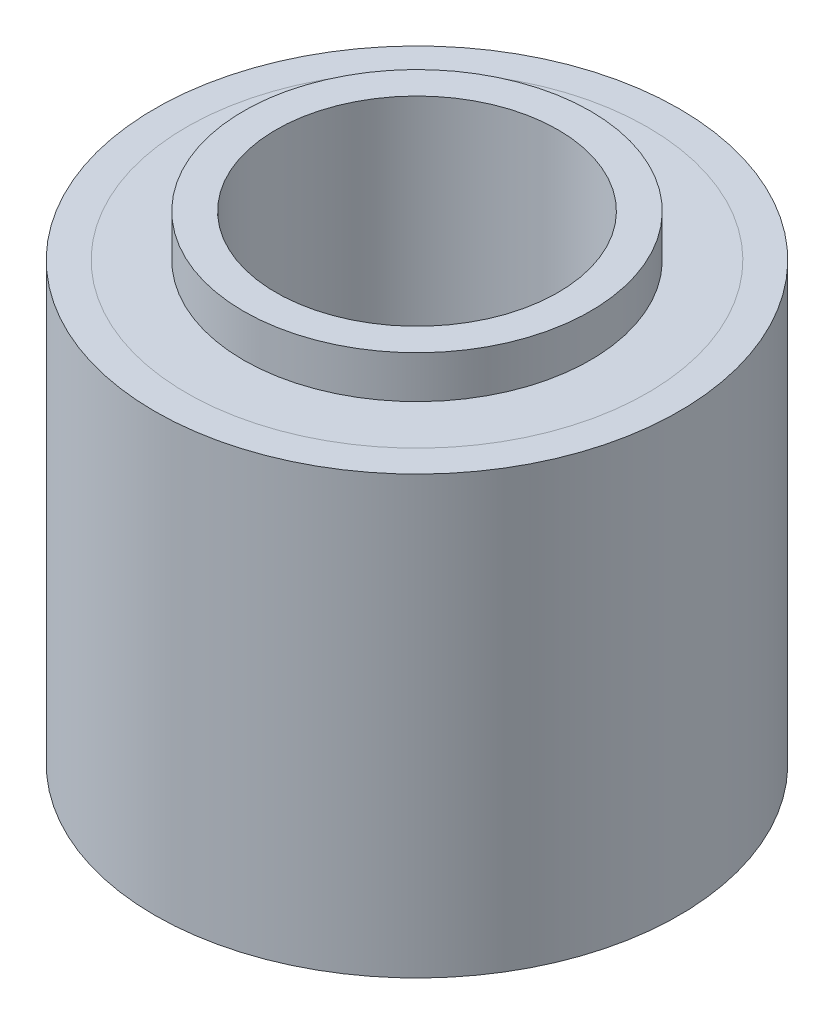
ISO-10303-21;
HEADER;
FILE_DESCRIPTION(('STEP AP214'),'2;1');
FILE_NAME('part.step','',(''),(''),'','','');
FILE_SCHEMA(('AUTOMOTIVE_DESIGN { 1 0 10303 214 1 1 1 1 }'));
ENDSEC;
DATA;
#1=APPLICATION_CONTEXT('core data for automotive mechanical design processes');
#2=APPLICATION_PROTOCOL_DEFINITION('international standard','automotive_design',2000,#1);
#3=PRODUCT_CONTEXT('',#1,'mechanical');
#4=PRODUCT('Part','Part','',(#3));
#5=PRODUCT_RELATED_PRODUCT_CATEGORY('part','',(#4));
#6=PRODUCT_DEFINITION_FORMATION('','',#4);
#7=PRODUCT_DEFINITION_CONTEXT('part definition',#1,'design');
#8=PRODUCT_DEFINITION('design','',#6,#7);
#9=PRODUCT_DEFINITION_SHAPE('','',#8);
#10=(LENGTH_UNIT() NAMED_UNIT(*) SI_UNIT(.MILLI.,.METRE.));
#11=(NAMED_UNIT(*) PLANE_ANGLE_UNIT() SI_UNIT($,.RADIAN.));
#12=(NAMED_UNIT(*) SI_UNIT($,.STERADIAN.) SOLID_ANGLE_UNIT());
#13=UNCERTAINTY_MEASURE_WITH_UNIT(LENGTH_MEASURE(1.E-05),#10,'distance_accuracy_value','');
#14=(GEOMETRIC_REPRESENTATION_CONTEXT(3) GLOBAL_UNCERTAINTY_ASSIGNED_CONTEXT((#13)) GLOBAL_UNIT_ASSIGNED_CONTEXT((#10,
#11,#12)) REPRESENTATION_CONTEXT('',''));
#15=CARTESIAN_POINT('',(0.,0.,0.));
#16=DIRECTION('',(0.,0.,1.));
#17=DIRECTION('',(1.,0.,0.));
#18=AXIS2_PLACEMENT_3D('',#15,#16,#17);
#19=CARTESIAN_POINT('',(0.,0.,0.));
#20=DIRECTION('',(0.,-1.,0.));
#21=DIRECTION('',(0.,0.,-1.));
#22=AXIS2_PLACEMENT_3D('',#19,#20,#21);
#23=CYLINDRICAL_SURFACE('',#22,10.65);
#24=CARTESIAN_POINT('',(0.,0.,0.));
#25=DIRECTION('',(0.,-1.,0.));
#26=DIRECTION('',(0.,0.,-1.));
#27=AXIS2_PLACEMENT_3D('',#24,#25,#26);
#28=CIRCLE('',#27,10.65);
#29=CARTESIAN_POINT('',(0.,0.,-10.65));
#30=VERTEX_POINT('',#29);
#31=EDGE_CURVE('E53',#30,#30,#28,.T.);
#32=ORIENTED_EDGE('',*,*,#31,.T.);
#33=EDGE_LOOP('',(#32));
#34=FACE_BOUND('',#33,.T.);
#35=CARTESIAN_POINT('',(0.,26.8,0.));
#36=DIRECTION('',(0.,-1.,0.));
#37=DIRECTION('',(0.,0.,-1.));
#38=AXIS2_PLACEMENT_3D('',#35,#36,#37);
#39=CIRCLE('',#38,10.65);
#40=CARTESIAN_POINT('',(0.,26.8,-10.65));
#41=VERTEX_POINT('',#40);
#42=EDGE_CURVE('E11',#41,#41,#39,.T.);
#43=ORIENTED_EDGE('',*,*,#42,.F.);
#44=EDGE_LOOP('',(#43));
#45=FACE_BOUND('',#44,.T.);
#46=ADVANCED_FACE('F39',(#34,#45),#23,.F.);
#47=CARTESIAN_POINT('',(10.65,26.8,0.));
#48=DIRECTION('',(0.,1.,0.));
#49=DIRECTION('',(0.,0.,1.));
#50=AXIS2_PLACEMENT_3D('',#47,#48,#49);
#51=PLANE('',#50);
#52=ORIENTED_EDGE('',*,*,#42,.T.);
#53=EDGE_LOOP('',(#52));
#54=FACE_BOUND('',#53,.T.);
#55=CARTESIAN_POINT('',(0.,26.8,0.));
#56=DIRECTION('',(0.,-1.,0.));
#57=DIRECTION('',(0.,0.,-1.));
#58=AXIS2_PLACEMENT_3D('',#55,#56,#57);
#59=CIRCLE('',#58,14.15);
#60=CARTESIAN_POINT('',(0.,26.8,-14.15));
#61=VERTEX_POINT('',#60);
#62=EDGE_CURVE('E45',#61,#61,#59,.T.);
#63=ORIENTED_EDGE('',*,*,#62,.F.);
#64=EDGE_LOOP('',(#63));
#65=FACE_BOUND('',#64,.T.);
#66=ADVANCED_FACE('F69',(#54,#65),#51,.T.);
#67=CARTESIAN_POINT('',(0.,0.,0.));
#68=DIRECTION('',(0.,-1.,0.));
#69=DIRECTION('',(0.,0.,-1.));
#70=AXIS2_PLACEMENT_3D('',#67,#68,#69);
#71=CYLINDRICAL_SURFACE('',#70,14.15);
#72=ORIENTED_EDGE('',*,*,#62,.T.);
#73=EDGE_LOOP('',(#72));
#74=FACE_BOUND('',#73,.T.);
#75=CARTESIAN_POINT('',(0.,0.,0.));
#76=DIRECTION('',(0.,-1.,0.));
#77=DIRECTION('',(0.,0.,-1.));
#78=AXIS2_PLACEMENT_3D('',#75,#76,#77);
#79=CIRCLE('',#78,14.15);
#80=CARTESIAN_POINT('',(0.,0.,-14.15));
#81=VERTEX_POINT('',#80);
#82=EDGE_CURVE('E49',#81,#81,#79,.T.);
#83=ORIENTED_EDGE('',*,*,#82,.F.);
#84=EDGE_LOOP('',(#83));
#85=FACE_BOUND('',#84,.T.);
#86=ADVANCED_FACE('F63',(#74,#85),#71,.T.);
#87=CARTESIAN_POINT('',(10.65,0.,0.));
#88=DIRECTION('',(0.,-1.,0.));
#89=DIRECTION('',(0.,0.,-1.));
#90=AXIS2_PLACEMENT_3D('',#87,#88,#89);
#91=PLANE('',#90);
#92=ORIENTED_EDGE('',*,*,#82,.T.);
#93=EDGE_LOOP('',(#92));
#94=FACE_BOUND('',#93,.T.);
#95=ORIENTED_EDGE('',*,*,#31,.F.);
#96=EDGE_LOOP('',(#95));
#97=FACE_BOUND('',#96,.T.);
#98=ADVANCED_FACE('F61',(#94,#97),#91,.T.);
#99=CLOSED_SHELL('',(#46,#66,#86,#98));
#100=MANIFOLD_SOLID_BREP('B2',#99);
#101=CARTESIAN_POINT('',(0.,0.,0.));
#102=DIRECTION('',(0.,-1.,0.));
#103=DIRECTION('',(0.,0.,-1.));
#104=AXIS2_PLACEMENT_3D('',#101,#102,#103);
#105=CYLINDRICAL_SURFACE('',#104,14.15);
#106=CARTESIAN_POINT('',(0.,0.,0.));
#107=DIRECTION('',(0.,-1.,0.));
#108=DIRECTION('',(0.,0.,-1.));
#109=AXIS2_PLACEMENT_3D('',#106,#107,#108);
#110=CIRCLE('',#109,14.15);
#111=CARTESIAN_POINT('',(0.,0.,-14.15));
#112=VERTEX_POINT('',#111);
#113=EDGE_CURVE('E121',#112,#112,#110,.T.);
#114=ORIENTED_EDGE('',*,*,#113,.T.);
#115=EDGE_LOOP('',(#114));
#116=FACE_BOUND('',#115,.T.);
#117=CARTESIAN_POINT('',(0.,26.8,0.));
#118=DIRECTION('',(0.,-1.,0.));
#119=DIRECTION('',(0.,0.,-1.));
#120=AXIS2_PLACEMENT_3D('',#117,#118,#119);
#121=CIRCLE('',#120,14.15);
#122=CARTESIAN_POINT('',(0.,26.8,-14.15));
#123=VERTEX_POINT('',#122);
#124=EDGE_CURVE('E38',#123,#123,#121,.T.);
#125=ORIENTED_EDGE('',*,*,#124,.F.);
#126=EDGE_LOOP('',(#125));
#127=FACE_BOUND('',#126,.T.);
#128=ADVANCED_FACE('F107',(#116,#127),#105,.F.);
#129=CARTESIAN_POINT('',(14.15,26.8,0.));
#130=DIRECTION('',(0.,1.,0.));
#131=DIRECTION('',(0.,0.,1.));
#132=AXIS2_PLACEMENT_3D('',#129,#130,#131);
#133=PLANE('',#132);
#134=ORIENTED_EDGE('',*,*,#124,.T.);
#135=EDGE_LOOP('',(#134));
#136=FACE_BOUND('',#135,.T.);
#137=CARTESIAN_POINT('',(0.,26.8,0.));
#138=DIRECTION('',(0.,-1.,0.));
#139=DIRECTION('',(0.,0.,-1.));
#140=AXIS2_PLACEMENT_3D('',#137,#138,#139);
#141=CIRCLE('',#140,16.1);
#142=CARTESIAN_POINT('',(0.,26.8,-16.1));
#143=VERTEX_POINT('',#142);
#144=EDGE_CURVE('E113',#143,#143,#141,.T.);
#145=ORIENTED_EDGE('',*,*,#144,.F.);
#146=EDGE_LOOP('',(#145));
#147=FACE_BOUND('',#146,.T.);
#148=ADVANCED_FACE('F137',(#136,#147),#133,.T.);
#149=CARTESIAN_POINT('',(0.,0.,0.));
#150=DIRECTION('',(0.,-1.,0.));
#151=DIRECTION('',(0.,0.,-1.));
#152=AXIS2_PLACEMENT_3D('',#149,#150,#151);
#153=CYLINDRICAL_SURFACE('',#152,16.1);
#154=ORIENTED_EDGE('',*,*,#144,.T.);
#155=EDGE_LOOP('',(#154));
#156=FACE_BOUND('',#155,.T.);
#157=CARTESIAN_POINT('',(0.,0.,0.));
#158=DIRECTION('',(0.,-1.,0.));
#159=DIRECTION('',(0.,0.,-1.));
#160=AXIS2_PLACEMENT_3D('',#157,#158,#159);
#161=CIRCLE('',#160,16.1);
#162=CARTESIAN_POINT('',(0.,0.,-16.1));
#163=VERTEX_POINT('',#162);
#164=EDGE_CURVE('E117',#163,#163,#161,.T.);
#165=ORIENTED_EDGE('',*,*,#164,.F.);
#166=EDGE_LOOP('',(#165));
#167=FACE_BOUND('',#166,.T.);
#168=ADVANCED_FACE('F131',(#156,#167),#153,.T.);
#169=CARTESIAN_POINT('',(14.15,0.,0.));
#170=DIRECTION('',(0.,-1.,0.));
#171=DIRECTION('',(0.,0.,-1.));
#172=AXIS2_PLACEMENT_3D('',#169,#170,#171);
#173=PLANE('',#172);
#174=ORIENTED_EDGE('',*,*,#164,.T.);
#175=EDGE_LOOP('',(#174));
#176=FACE_BOUND('',#175,.T.);
#177=ORIENTED_EDGE('',*,*,#113,.F.);
#178=EDGE_LOOP('',(#177));
#179=FACE_BOUND('',#178,.T.);
#180=ADVANCED_FACE('F129',(#176,#179),#173,.T.);
#181=CLOSED_SHELL('',(#128,#148,#168,#180));
#182=MANIFOLD_SOLID_BREP('B6',#181);
#183=CARTESIAN_POINT('',(0.,0.,0.));
#184=DIRECTION('',(0.,-1.,0.));
#185=DIRECTION('',(0.,0.,-1.));
#186=AXIS2_PLACEMENT_3D('',#183,#184,#185);
#187=CYLINDRICAL_SURFACE('',#186,8.66);
#188=CARTESIAN_POINT('',(0.,0.,0.));
#189=DIRECTION('',(0.,-1.,0.));
#190=DIRECTION('',(0.,0.,-1.));
#191=AXIS2_PLACEMENT_3D('',#188,#189,#190);
#192=CIRCLE('',#191,8.66);
#193=CARTESIAN_POINT('',(0.,0.,-8.66));
#194=VERTEX_POINT('',#193);
#195=EDGE_CURVE('E182',#194,#194,#192,.T.);
#196=ORIENTED_EDGE('',*,*,#195,.T.);
#197=EDGE_LOOP('',(#196));
#198=FACE_BOUND('',#197,.T.);
#199=CARTESIAN_POINT('',(0.,29.4,0.));
#200=DIRECTION('',(0.,-1.,0.));
#201=DIRECTION('',(0.,0.,-1.));
#202=AXIS2_PLACEMENT_3D('',#199,#200,#201);
#203=CIRCLE('',#202,8.66);
#204=CARTESIAN_POINT('',(0.,29.4,-8.66));
#205=VERTEX_POINT('',#204);
#206=EDGE_CURVE('E106',#205,#205,#203,.T.);
#207=ORIENTED_EDGE('',*,*,#206,.F.);
#208=EDGE_LOOP('',(#207));
#209=FACE_BOUND('',#208,.T.);
#210=ADVANCED_FACE('F168',(#198,#209),#187,.F.);
#211=CARTESIAN_POINT('',(8.66,29.4,0.));
#212=DIRECTION('',(0.,1.,0.));
#213=DIRECTION('',(0.,0.,1.));
#214=AXIS2_PLACEMENT_3D('',#211,#212,#213);
#215=PLANE('',#214);
#216=ORIENTED_EDGE('',*,*,#206,.T.);
#217=EDGE_LOOP('',(#216));
#218=FACE_BOUND('',#217,.T.);
#219=CARTESIAN_POINT('',(0.,29.4,0.));
#220=DIRECTION('',(0.,-1.,0.));
#221=DIRECTION('',(0.,0.,-1.));
#222=AXIS2_PLACEMENT_3D('',#219,#220,#221);
#223=CIRCLE('',#222,10.65);
#224=CARTESIAN_POINT('',(0.,29.4,-10.65));
#225=VERTEX_POINT('',#224);
#226=EDGE_CURVE('E174',#225,#225,#223,.T.);
#227=ORIENTED_EDGE('',*,*,#226,.F.);
#228=EDGE_LOOP('',(#227));
#229=FACE_BOUND('',#228,.T.);
#230=ADVANCED_FACE('F198',(#218,#229),#215,.T.);
#231=CARTESIAN_POINT('',(0.,0.,0.));
#232=DIRECTION('',(0.,-1.,0.));
#233=DIRECTION('',(0.,0.,-1.));
#234=AXIS2_PLACEMENT_3D('',#231,#232,#233);
#235=CYLINDRICAL_SURFACE('',#234,10.65);
#236=ORIENTED_EDGE('',*,*,#226,.T.);
#237=EDGE_LOOP('',(#236));
#238=FACE_BOUND('',#237,.T.);
#239=CARTESIAN_POINT('',(0.,0.,0.));
#240=DIRECTION('',(0.,-1.,0.));
#241=DIRECTION('',(0.,0.,-1.));
#242=AXIS2_PLACEMENT_3D('',#239,#240,#241);
#243=CIRCLE('',#242,10.65);
#244=CARTESIAN_POINT('',(0.,0.,-10.65));
#245=VERTEX_POINT('',#244);
#246=EDGE_CURVE('E178',#245,#245,#243,.T.);
#247=ORIENTED_EDGE('',*,*,#246,.F.);
#248=EDGE_LOOP('',(#247));
#249=FACE_BOUND('',#248,.T.);
#250=ADVANCED_FACE('F192',(#238,#249),#235,.T.);
#251=CARTESIAN_POINT('',(8.66,0.,0.));
#252=DIRECTION('',(0.,-1.,0.));
#253=DIRECTION('',(0.,0.,-1.));
#254=AXIS2_PLACEMENT_3D('',#251,#252,#253);
#255=PLANE('',#254);
#256=ORIENTED_EDGE('',*,*,#246,.T.);
#257=EDGE_LOOP('',(#256));
#258=FACE_BOUND('',#257,.T.);
#259=ORIENTED_EDGE('',*,*,#195,.F.);
#260=EDGE_LOOP('',(#259));
#261=FACE_BOUND('',#260,.T.);
#262=ADVANCED_FACE('F190',(#258,#261),#255,.T.);
#263=CLOSED_SHELL('',(#210,#230,#250,#262));
#264=MANIFOLD_SOLID_BREP('B33',#263);
#265=ADVANCED_BREP_SHAPE_REPRESENTATION('',(#18,#100,#182,#264),#14);
#266=SHAPE_DEFINITION_REPRESENTATION(#9,#265);
ENDSEC;
END-ISO-10303-21;
